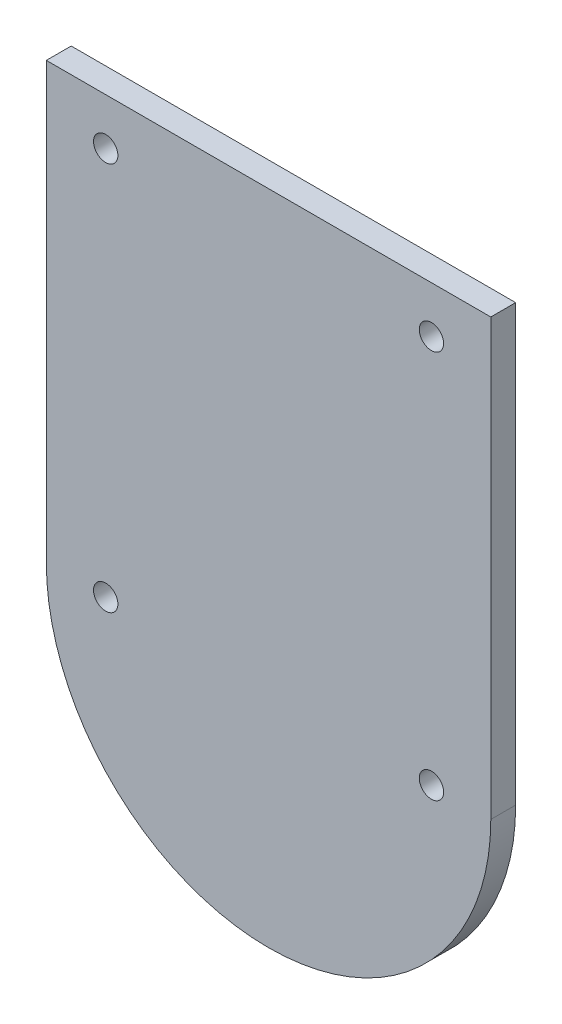
ISO-10303-21;
HEADER;
FILE_DESCRIPTION(('STEP AP214'),'2;1');
FILE_NAME('part.step','',(''),(''),'','','');
FILE_SCHEMA(('AUTOMOTIVE_DESIGN { 1 0 10303 214 1 1 1 1 }'));
ENDSEC;
DATA;
#1=APPLICATION_CONTEXT('core data for automotive mechanical design processes');
#2=APPLICATION_PROTOCOL_DEFINITION('international standard','automotive_design',2000,#1);
#3=PRODUCT_CONTEXT('',#1,'mechanical');
#4=PRODUCT('Part','Part','',(#3));
#5=PRODUCT_RELATED_PRODUCT_CATEGORY('part','',(#4));
#6=PRODUCT_DEFINITION_FORMATION('','',#4);
#7=PRODUCT_DEFINITION_CONTEXT('part definition',#1,'design');
#8=PRODUCT_DEFINITION('design','',#6,#7);
#9=PRODUCT_DEFINITION_SHAPE('','',#8);
#10=(LENGTH_UNIT() NAMED_UNIT(*) SI_UNIT(.MILLI.,.METRE.));
#11=(NAMED_UNIT(*) PLANE_ANGLE_UNIT() SI_UNIT($,.RADIAN.));
#12=(NAMED_UNIT(*) SI_UNIT($,.STERADIAN.) SOLID_ANGLE_UNIT());
#13=UNCERTAINTY_MEASURE_WITH_UNIT(LENGTH_MEASURE(1.E-05),#10,'distance_accuracy_value','');
#14=(GEOMETRIC_REPRESENTATION_CONTEXT(3) GLOBAL_UNCERTAINTY_ASSIGNED_CONTEXT((#13)) GLOBAL_UNIT_ASSIGNED_CONTEXT((#10,
#11,#12)) REPRESENTATION_CONTEXT('',''));
#15=CARTESIAN_POINT('',(0.,0.,0.));
#16=DIRECTION('',(0.,0.,1.));
#17=DIRECTION('',(1.,0.,0.));
#18=AXIS2_PLACEMENT_3D('',#15,#16,#17);
#19=CARTESIAN_POINT('',(0.,27.6698090416413,1.6));
#20=DIRECTION('',(0.,1.,0.));
#21=DIRECTION('',(0.,0.,1.));
#22=AXIS2_PLACEMENT_3D('',#19,#20,#21);
#23=PLANE('',#22);
#24=DIRECTION('',(1.,0.,0.));
#25=VECTOR('',#24,1.);
#26=CARTESIAN_POINT('',(0.,27.6698090416413,0.));
#27=LINE('',#26,#25);
#28=CARTESIAN_POINT('',(-37.2121128013917,27.6698090416413,0.));
#29=VERTEX_POINT('',#28);
#30=CARTESIAN_POINT('',(-8.61211280139167,27.6698090416413,0.));
#31=VERTEX_POINT('',#30);
#32=EDGE_CURVE('E84',#29,#31,#27,.T.);
#33=ORIENTED_EDGE('',*,*,#32,.F.);
#34=DIRECTION('',(0.,0.,-1.));
#35=VECTOR('',#34,1.);
#36=CARTESIAN_POINT('',(-37.2121128013917,27.6698090416413,1.6));
#37=LINE('',#36,#35);
#38=CARTESIAN_POINT('',(-37.2121128013917,27.6698090416413,1.6));
#39=VERTEX_POINT('',#38);
#40=EDGE_CURVE('E11',#39,#29,#37,.T.);
#41=ORIENTED_EDGE('',*,*,#40,.F.);
#42=DIRECTION('',(1.,0.,0.));
#43=VECTOR('',#42,1.);
#44=CARTESIAN_POINT('',(0.,27.6698090416413,1.6));
#45=LINE('',#44,#43);
#46=CARTESIAN_POINT('',(-8.61211280139167,27.6698090416413,1.6));
#47=VERTEX_POINT('',#46);
#48=EDGE_CURVE('E90',#39,#47,#45,.T.);
#49=ORIENTED_EDGE('',*,*,#48,.T.);
#50=DIRECTION('',(0.,0.,-1.));
#51=VECTOR('',#50,1.);
#52=CARTESIAN_POINT('',(-8.61211280139167,27.6698090416413,1.6));
#53=LINE('',#52,#51);
#54=EDGE_CURVE('E63',#47,#31,#53,.T.);
#55=ORIENTED_EDGE('',*,*,#54,.T.);
#56=EDGE_LOOP('',(#33,#41,#49,#55));
#57=FACE_BOUND('',#56,.T.);
#58=ADVANCED_FACE('F44',(#57),#23,.T.);
#59=CARTESIAN_POINT('',(-37.2121128013917,0.,1.6));
#60=DIRECTION('',(1.,0.,0.));
#61=DIRECTION('',(0.,0.,-1.));
#62=AXIS2_PLACEMENT_3D('',#59,#60,#61);
#63=PLANE('',#62);
#64=DIRECTION('',(0.,-1.,0.));
#65=VECTOR('',#64,1.);
#66=CARTESIAN_POINT('',(-37.2121128013917,0.,0.));
#67=LINE('',#66,#65);
#68=CARTESIAN_POINT('',(-37.2121128013917,-0.330212606078735,0.));
#69=VERTEX_POINT('',#68);
#70=EDGE_CURVE('E105',#29,#69,#67,.T.);
#71=ORIENTED_EDGE('',*,*,#70,.T.);
#72=DIRECTION('',(0.,0.,-1.));
#73=VECTOR('',#72,1.);
#74=CARTESIAN_POINT('',(-37.2121128013917,-0.330212606078735,1.6));
#75=LINE('',#74,#73);
#76=CARTESIAN_POINT('',(-37.2121128013917,-0.330212606078735,1.6));
#77=VERTEX_POINT('',#76);
#78=EDGE_CURVE('E52',#77,#69,#75,.T.);
#79=ORIENTED_EDGE('',*,*,#78,.F.);
#80=DIRECTION('',(0.,-1.,0.));
#81=VECTOR('',#80,1.);
#82=CARTESIAN_POINT('',(-37.2121128013917,0.,1.6));
#83=LINE('',#82,#81);
#84=EDGE_CURVE('E95',#39,#77,#83,.T.);
#85=ORIENTED_EDGE('',*,*,#84,.F.);
#86=ORIENTED_EDGE('',*,*,#40,.T.);
#87=EDGE_LOOP('',(#71,#79,#85,#86));
#88=FACE_BOUND('',#87,.T.);
#89=ADVANCED_FACE('F101',(#88),#63,.F.);
#90=CARTESIAN_POINT('',(-22.9121128013917,-0.330201782079756,1.6));
#91=DIRECTION('',(0.,0.,-1.));
#92=DIRECTION('',(-1.,0.,0.));
#93=AXIS2_PLACEMENT_3D('',#90,#91,#92);
#94=CYLINDRICAL_SURFACE('',#93,14.3000000000041);
#95=CARTESIAN_POINT('',(-22.9121128013917,-0.330201782079756,0.));
#96=DIRECTION('',(0.,0.,1.));
#97=DIRECTION('',(1.,0.,0.));
#98=AXIS2_PLACEMENT_3D('',#95,#96,#97);
#99=CIRCLE('',#98,14.3000000000041);
#100=CARTESIAN_POINT('',(-8.61211280139167,-0.330190958080777,0.));
#101=VERTEX_POINT('',#100);
#102=EDGE_CURVE('E125',#69,#101,#99,.T.);
#103=ORIENTED_EDGE('',*,*,#102,.T.);
#104=DIRECTION('',(0.,0.,-1.));
#105=VECTOR('',#104,1.);
#106=CARTESIAN_POINT('',(-8.61211280139167,-0.330190958080777,1.6));
#107=LINE('',#106,#105);
#108=CARTESIAN_POINT('',(-8.61211280139167,-0.330190958080777,1.6));
#109=VERTEX_POINT('',#108);
#110=EDGE_CURVE('E73',#109,#101,#107,.T.);
#111=ORIENTED_EDGE('',*,*,#110,.F.);
#112=CARTESIAN_POINT('',(-22.9121128013917,-0.330201782079756,1.6));
#113=DIRECTION('',(0.,0.,1.));
#114=DIRECTION('',(1.,0.,0.));
#115=AXIS2_PLACEMENT_3D('',#112,#113,#114);
#116=CIRCLE('',#115,14.3000000000041);
#117=EDGE_CURVE('E100',#77,#109,#116,.T.);
#118=ORIENTED_EDGE('',*,*,#117,.F.);
#119=ORIENTED_EDGE('',*,*,#78,.T.);
#120=EDGE_LOOP('',(#103,#111,#118,#119));
#121=FACE_BOUND('',#120,.T.);
#122=ADVANCED_FACE('F104',(#121),#94,.T.);
#123=CARTESIAN_POINT('',(-33.3921128013234,-0.330190958080774,1.6));
#124=DIRECTION('',(0.,0.,-1.));
#125=DIRECTION('',(-1.,0.,0.));
#126=AXIS2_PLACEMENT_3D('',#123,#124,#125);
#127=CYLINDRICAL_SURFACE('',#126,0.783493599999997);
#128=CARTESIAN_POINT('',(-33.3921128013234,-0.330190958080774,1.6));
#129=DIRECTION('',(0.,0.,1.));
#130=DIRECTION('',(1.,0.,0.));
#131=AXIS2_PLACEMENT_3D('',#128,#129,#130);
#132=CIRCLE('',#131,0.783493599999997);
#133=CARTESIAN_POINT('',(-32.6086192013234,-0.330190958080774,1.6));
#134=VERTEX_POINT('',#133);
#135=EDGE_CURVE('E119',#134,#134,#132,.T.);
#136=ORIENTED_EDGE('',*,*,#135,.T.);
#137=EDGE_LOOP('',(#136));
#138=FACE_BOUND('',#137,.T.);
#139=CARTESIAN_POINT('',(-33.3921128013234,-0.330190958080774,0.));
#140=DIRECTION('',(0.,0.,1.));
#141=DIRECTION('',(1.,0.,0.));
#142=AXIS2_PLACEMENT_3D('',#139,#140,#141);
#143=CIRCLE('',#142,0.783493599999997);
#144=CARTESIAN_POINT('',(-32.6086192013234,-0.330190958080774,0.));
#145=VERTEX_POINT('',#144);
#146=EDGE_CURVE('E131',#145,#145,#143,.T.);
#147=ORIENTED_EDGE('',*,*,#146,.F.);
#148=EDGE_LOOP('',(#147));
#149=FACE_BOUND('',#148,.T.);
#150=ADVANCED_FACE('F171',(#138,#149),#127,.F.);
#151=CARTESIAN_POINT('',(-12.4321128013234,24.6698090419192,1.6));
#152=DIRECTION('',(0.,0.,-1.));
#153=DIRECTION('',(-1.,0.,0.));
#154=AXIS2_PLACEMENT_3D('',#151,#152,#153);
#155=CYLINDRICAL_SURFACE('',#154,0.783493600000001);
#156=CARTESIAN_POINT('',(-12.4321128013234,24.6698090419192,1.6));
#157=DIRECTION('',(0.,0.,1.));
#158=DIRECTION('',(1.,0.,0.));
#159=AXIS2_PLACEMENT_3D('',#156,#157,#158);
#160=CIRCLE('',#159,0.783493600000001);
#161=CARTESIAN_POINT('',(-11.6486192013234,24.6698090419192,1.6));
#162=VERTEX_POINT('',#161);
#163=EDGE_CURVE('E111',#162,#162,#160,.T.);
#164=ORIENTED_EDGE('',*,*,#163,.T.);
#165=EDGE_LOOP('',(#164));
#166=FACE_BOUND('',#165,.T.);
#167=CARTESIAN_POINT('',(-12.4321128013234,24.6698090419192,0.));
#168=DIRECTION('',(0.,0.,1.));
#169=DIRECTION('',(1.,0.,0.));
#170=AXIS2_PLACEMENT_3D('',#167,#168,#169);
#171=CIRCLE('',#170,0.783493600000001);
#172=CARTESIAN_POINT('',(-11.6486192013234,24.6698090419192,0.));
#173=VERTEX_POINT('',#172);
#174=EDGE_CURVE('E134',#173,#173,#171,.T.);
#175=ORIENTED_EDGE('',*,*,#174,.F.);
#176=EDGE_LOOP('',(#175));
#177=FACE_BOUND('',#176,.T.);
#178=ADVANCED_FACE('F180',(#166,#177),#155,.F.);
#179=CARTESIAN_POINT('',(-33.3921128013234,24.6698090419192,1.6));
#180=DIRECTION('',(0.,0.,-1.));
#181=DIRECTION('',(-1.,0.,0.));
#182=AXIS2_PLACEMENT_3D('',#179,#180,#181);
#183=CYLINDRICAL_SURFACE('',#182,0.783493599999997);
#184=CARTESIAN_POINT('',(-33.3921128013234,24.6698090419192,1.6));
#185=DIRECTION('',(0.,0.,1.));
#186=DIRECTION('',(1.,0.,0.));
#187=AXIS2_PLACEMENT_3D('',#184,#185,#186);
#188=CIRCLE('',#187,0.783493599999997);
#189=CARTESIAN_POINT('',(-32.6086192013234,24.6698090419192,1.6));
#190=VERTEX_POINT('',#189);
#191=EDGE_CURVE('E107',#190,#190,#188,.T.);
#192=ORIENTED_EDGE('',*,*,#191,.T.);
#193=EDGE_LOOP('',(#192));
#194=FACE_BOUND('',#193,.T.);
#195=CARTESIAN_POINT('',(-33.3921128013234,24.6698090419192,0.));
#196=DIRECTION('',(0.,0.,1.));
#197=DIRECTION('',(1.,0.,0.));
#198=AXIS2_PLACEMENT_3D('',#195,#196,#197);
#199=CIRCLE('',#198,0.783493599999997);
#200=CARTESIAN_POINT('',(-32.6086192013234,24.6698090419192,0.));
#201=VERTEX_POINT('',#200);
#202=EDGE_CURVE('E129',#201,#201,#199,.T.);
#203=ORIENTED_EDGE('',*,*,#202,.F.);
#204=EDGE_LOOP('',(#203));
#205=FACE_BOUND('',#204,.T.);
#206=ADVANCED_FACE('F167',(#194,#205),#183,.F.);
#207=CARTESIAN_POINT('',(-8.61211280139167,0.,1.6));
#208=DIRECTION('',(1.,0.,0.));
#209=DIRECTION('',(0.,1.,0.));
#210=AXIS2_PLACEMENT_3D('',#207,#208,#209);
#211=PLANE('',#210);
#212=DIRECTION('',(0.,-1.,0.));
#213=VECTOR('',#212,1.);
#214=CARTESIAN_POINT('',(-8.61211280139167,0.,0.));
#215=LINE('',#214,#213);
#216=EDGE_CURVE('E130',#31,#101,#215,.T.);
#217=ORIENTED_EDGE('',*,*,#216,.F.);
#218=ORIENTED_EDGE('',*,*,#54,.F.);
#219=DIRECTION('',(0.,-1.,0.));
#220=VECTOR('',#219,1.);
#221=CARTESIAN_POINT('',(-8.61211280139167,0.,1.6));
#222=LINE('',#221,#220);
#223=EDGE_CURVE('E106',#47,#109,#222,.T.);
#224=ORIENTED_EDGE('',*,*,#223,.T.);
#225=ORIENTED_EDGE('',*,*,#110,.T.);
#226=EDGE_LOOP('',(#217,#218,#224,#225));
#227=FACE_BOUND('',#226,.T.);
#228=ADVANCED_FACE('F141',(#227),#211,.T.);
#229=CARTESIAN_POINT('',(-12.4321128013234,-0.330190958080816,1.6));
#230=DIRECTION('',(0.,0.,-1.));
#231=DIRECTION('',(-1.,0.,0.));
#232=AXIS2_PLACEMENT_3D('',#229,#230,#231);
#233=CYLINDRICAL_SURFACE('',#232,0.783493600000001);
#234=CARTESIAN_POINT('',(-12.4321128013234,-0.330190958080816,1.6));
#235=DIRECTION('',(0.,0.,1.));
#236=DIRECTION('',(1.,0.,0.));
#237=AXIS2_PLACEMENT_3D('',#234,#235,#236);
#238=CIRCLE('',#237,0.783493600000001);
#239=CARTESIAN_POINT('',(-11.6486192013234,-0.330190958080816,1.6));
#240=VERTEX_POINT('',#239);
#241=EDGE_CURVE('E116',#240,#240,#238,.T.);
#242=ORIENTED_EDGE('',*,*,#241,.T.);
#243=EDGE_LOOP('',(#242));
#244=FACE_BOUND('',#243,.T.);
#245=CARTESIAN_POINT('',(-12.4321128013234,-0.330190958080816,0.));
#246=DIRECTION('',(0.,0.,1.));
#247=DIRECTION('',(1.,0.,0.));
#248=AXIS2_PLACEMENT_3D('',#245,#246,#247);
#249=CIRCLE('',#248,0.783493600000001);
#250=CARTESIAN_POINT('',(-11.6486192013234,-0.330190958080816,0.));
#251=VERTEX_POINT('',#250);
#252=EDGE_CURVE('E139',#251,#251,#249,.T.);
#253=ORIENTED_EDGE('',*,*,#252,.F.);
#254=EDGE_LOOP('',(#253));
#255=FACE_BOUND('',#254,.T.);
#256=ADVANCED_FACE('F156',(#244,#255),#233,.F.);
#257=CARTESIAN_POINT('',(0.,0.,1.6));
#258=DIRECTION('',(0.,0.,1.));
#259=DIRECTION('',(1.,0.,0.));
#260=AXIS2_PLACEMENT_3D('',#257,#258,#259);
#261=PLANE('',#260);
#262=ORIENTED_EDGE('',*,*,#48,.F.);
#263=ORIENTED_EDGE('',*,*,#84,.T.);
#264=ORIENTED_EDGE('',*,*,#117,.T.);
#265=ORIENTED_EDGE('',*,*,#223,.F.);
#266=EDGE_LOOP('',(#262,#263,#264,#265));
#267=FACE_BOUND('',#266,.T.);
#268=ORIENTED_EDGE('',*,*,#191,.F.);
#269=EDGE_LOOP('',(#268));
#270=FACE_BOUND('',#269,.T.);
#271=ORIENTED_EDGE('',*,*,#163,.F.);
#272=EDGE_LOOP('',(#271));
#273=FACE_BOUND('',#272,.T.);
#274=ORIENTED_EDGE('',*,*,#135,.F.);
#275=EDGE_LOOP('',(#274));
#276=FACE_BOUND('',#275,.T.);
#277=ORIENTED_EDGE('',*,*,#241,.F.);
#278=EDGE_LOOP('',(#277));
#279=FACE_BOUND('',#278,.T.);
#280=ADVANCED_FACE('F94',(#267,#270,#273,#276,#279),#261,.T.);
#281=CARTESIAN_POINT('',(0.,0.,0.));
#282=DIRECTION('',(0.,0.,1.));
#283=DIRECTION('',(1.,0.,0.));
#284=AXIS2_PLACEMENT_3D('',#281,#282,#283);
#285=PLANE('',#284);
#286=ORIENTED_EDGE('',*,*,#32,.T.);
#287=ORIENTED_EDGE('',*,*,#216,.T.);
#288=ORIENTED_EDGE('',*,*,#102,.F.);
#289=ORIENTED_EDGE('',*,*,#70,.F.);
#290=EDGE_LOOP('',(#286,#287,#288,#289));
#291=FACE_BOUND('',#290,.T.);
#292=ORIENTED_EDGE('',*,*,#202,.T.);
#293=EDGE_LOOP('',(#292));
#294=FACE_BOUND('',#293,.T.);
#295=ORIENTED_EDGE('',*,*,#174,.T.);
#296=EDGE_LOOP('',(#295));
#297=FACE_BOUND('',#296,.T.);
#298=ORIENTED_EDGE('',*,*,#146,.T.);
#299=EDGE_LOOP('',(#298));
#300=FACE_BOUND('',#299,.T.);
#301=ORIENTED_EDGE('',*,*,#252,.T.);
#302=EDGE_LOOP('',(#301));
#303=FACE_BOUND('',#302,.T.);
#304=ADVANCED_FACE('F145',(#291,#294,#297,#300,#303),#285,.F.);
#305=CLOSED_SHELL('',(#58,#89,#122,#150,#178,#206,#228,#256,#280,#304));
#306=MANIFOLD_SOLID_BREP('B2',#305);
#307=ADVANCED_BREP_SHAPE_REPRESENTATION('',(#18,#306),#14);
#308=SHAPE_DEFINITION_REPRESENTATION(#9,#307);
ENDSEC;
END-ISO-10303-21;
